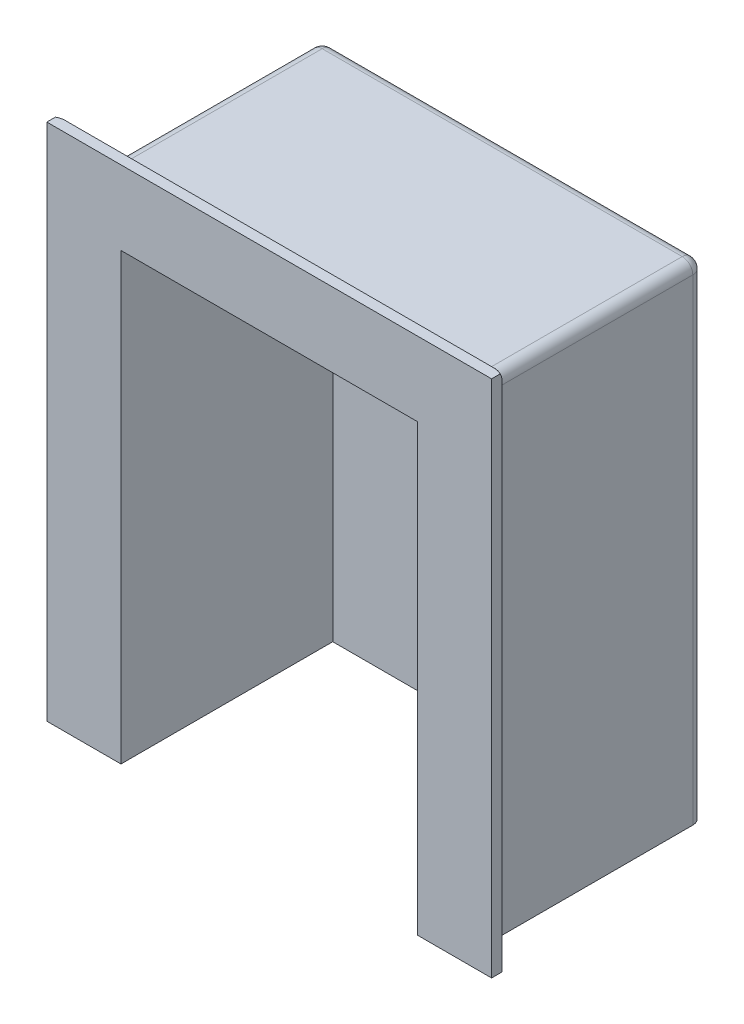
ISO-10303-21;
HEADER;
FILE_DESCRIPTION(('STEP AP214'),'2;1');
FILE_NAME('part.step','',(''),(''),'','','');
FILE_SCHEMA(('AUTOMOTIVE_DESIGN { 1 0 10303 214 1 1 1 1 }'));
ENDSEC;
DATA;
#1=APPLICATION_CONTEXT('core data for automotive mechanical design processes');
#2=APPLICATION_PROTOCOL_DEFINITION('international standard','automotive_design',2000,#1);
#3=PRODUCT_CONTEXT('',#1,'mechanical');
#4=PRODUCT('Part','Part','',(#3));
#5=PRODUCT_RELATED_PRODUCT_CATEGORY('part','',(#4));
#6=PRODUCT_DEFINITION_FORMATION('','',#4);
#7=PRODUCT_DEFINITION_CONTEXT('part definition',#1,'design');
#8=PRODUCT_DEFINITION('design','',#6,#7);
#9=PRODUCT_DEFINITION_SHAPE('','',#8);
#10=(LENGTH_UNIT() NAMED_UNIT(*) SI_UNIT(.MILLI.,.METRE.));
#11=(NAMED_UNIT(*) PLANE_ANGLE_UNIT() SI_UNIT($,.RADIAN.));
#12=(NAMED_UNIT(*) SI_UNIT($,.STERADIAN.) SOLID_ANGLE_UNIT());
#13=UNCERTAINTY_MEASURE_WITH_UNIT(LENGTH_MEASURE(1.E-05),#10,'distance_accuracy_value','');
#14=(GEOMETRIC_REPRESENTATION_CONTEXT(3) GLOBAL_UNCERTAINTY_ASSIGNED_CONTEXT((#13)) GLOBAL_UNIT_ASSIGNED_CONTEXT((#10,
#11,#12)) REPRESENTATION_CONTEXT('',''));
#15=CARTESIAN_POINT('',(0.,0.,0.));
#16=DIRECTION('',(0.,0.,1.));
#17=DIRECTION('',(1.,0.,0.));
#18=AXIS2_PLACEMENT_3D('',#15,#16,#17);
#19=CARTESIAN_POINT('',(9.,0.,11.5));
#20=DIRECTION('',(-1.,0.,0.));
#21=DIRECTION('',(0.,0.,1.));
#22=AXIS2_PLACEMENT_3D('',#19,#20,#21);
#23=PLANE('',#22);
#24=DIRECTION('',(0.,1.,0.));
#25=VECTOR('',#24,1.);
#26=CARTESIAN_POINT('',(9.,0.,0.5));
#27=LINE('',#26,#25);
#28=CARTESIAN_POINT('',(9.,-10.5,0.5));
#29=VERTEX_POINT('',#28);
#30=CARTESIAN_POINT('',(9.,12.,0.5));
#31=VERTEX_POINT('',#30);
#32=EDGE_CURVE('E336',#29,#31,#27,.T.);
#33=ORIENTED_EDGE('',*,*,#32,.T.);
#34=DIRECTION('',(0.,0.,-1.));
#35=VECTOR('',#34,1.);
#36=CARTESIAN_POINT('',(9.,12.,9.49999999999999));
#37=LINE('',#36,#35);
#38=CARTESIAN_POINT('',(9.,12.,9.49999999999999));
#39=VERTEX_POINT('',#38);
#40=EDGE_CURVE('E339',#31,#39,#37,.F.);
#41=ORIENTED_EDGE('',*,*,#40,.T.);
#42=DIRECTION('',(0.,-1.,0.));
#43=VECTOR('',#42,1.);
#44=CARTESIAN_POINT('',(9.,-10.5,9.49999999999999));
#45=LINE('',#44,#43);
#46=CARTESIAN_POINT('',(9.,-10.5,9.49999999999999));
#47=VERTEX_POINT('',#46);
#48=EDGE_CURVE('E301',#39,#47,#45,.T.);
#49=ORIENTED_EDGE('',*,*,#48,.T.);
#50=DIRECTION('',(0.,0.,-1.));
#51=VECTOR('',#50,1.);
#52=CARTESIAN_POINT('',(9.,-10.5,11.5));
#53=LINE('',#52,#51);
#54=EDGE_CURVE('E192',#47,#29,#53,.T.);
#55=ORIENTED_EDGE('',*,*,#54,.T.);
#56=EDGE_LOOP('',(#33,#41,#49,#55));
#57=FACE_BOUND('',#56,.T.);
#58=ADVANCED_FACE('F43',(#57),#23,.F.);
#59=CARTESIAN_POINT('',(0.,12.5,11.5));
#60=DIRECTION('',(0.,1.,0.));
#61=DIRECTION('',(-1.,0.,0.));
#62=AXIS2_PLACEMENT_3D('',#59,#60,#61);
#63=PLANE('',#62);
#64=DIRECTION('',(1.,0.,0.));
#65=VECTOR('',#64,1.);
#66=CARTESIAN_POINT('',(0.,12.5,9.49999999999999));
#67=LINE('',#66,#65);
#68=CARTESIAN_POINT('',(-8.5,12.5,9.49999999999999));
#69=VERTEX_POINT('',#68);
#70=CARTESIAN_POINT('',(8.5,12.5,9.49999999999999));
#71=VERTEX_POINT('',#70);
#72=EDGE_CURVE('E297',#69,#71,#67,.T.);
#73=ORIENTED_EDGE('',*,*,#72,.T.);
#74=DIRECTION('',(0.,0.,-1.));
#75=VECTOR('',#74,1.);
#76=CARTESIAN_POINT('',(8.5,12.5,0.));
#77=LINE('',#76,#75);
#78=CARTESIAN_POINT('',(8.5,12.5,0.5));
#79=VERTEX_POINT('',#78);
#80=EDGE_CURVE('E333',#71,#79,#77,.T.);
#81=ORIENTED_EDGE('',*,*,#80,.T.);
#82=DIRECTION('',(1.,0.,0.));
#83=VECTOR('',#82,1.);
#84=CARTESIAN_POINT('',(-9.,12.5,0.5));
#85=LINE('',#84,#83);
#86=CARTESIAN_POINT('',(-8.5,12.5,0.5));
#87=VERTEX_POINT('',#86);
#88=EDGE_CURVE('E327',#79,#87,#85,.F.);
#89=ORIENTED_EDGE('',*,*,#88,.T.);
#90=DIRECTION('',(0.,0.,-1.));
#91=VECTOR('',#90,1.);
#92=CARTESIAN_POINT('',(-8.5,12.5,11.5));
#93=LINE('',#92,#91);
#94=EDGE_CURVE('E330',#87,#69,#93,.F.);
#95=ORIENTED_EDGE('',*,*,#94,.T.);
#96=EDGE_LOOP('',(#73,#81,#89,#95));
#97=FACE_BOUND('',#96,.T.);
#98=ADVANCED_FACE('F461',(#97),#63,.T.);
#99=CARTESIAN_POINT('',(-9.,0.,11.5));
#100=DIRECTION('',(-1.,0.,0.));
#101=DIRECTION('',(0.,0.,1.));
#102=AXIS2_PLACEMENT_3D('',#99,#100,#101);
#103=PLANE('',#102);
#104=DIRECTION('',(0.,1.,0.));
#105=VECTOR('',#104,1.);
#106=CARTESIAN_POINT('',(-9.,0.,9.49999999999999));
#107=LINE('',#106,#105);
#108=CARTESIAN_POINT('',(-9.,-10.5,9.49999999999999));
#109=VERTEX_POINT('',#108);
#110=CARTESIAN_POINT('',(-9.,12.,9.49999999999999));
#111=VERTEX_POINT('',#110);
#112=EDGE_CURVE('E290',#109,#111,#107,.T.);
#113=ORIENTED_EDGE('',*,*,#112,.T.);
#114=DIRECTION('',(0.,0.,-1.));
#115=VECTOR('',#114,1.);
#116=CARTESIAN_POINT('',(-9.,12.,11.5));
#117=LINE('',#116,#115);
#118=CARTESIAN_POINT('',(-9.,12.,0.5));
#119=VERTEX_POINT('',#118);
#120=EDGE_CURVE('E345',#111,#119,#117,.T.);
#121=ORIENTED_EDGE('',*,*,#120,.T.);
#122=DIRECTION('',(0.,1.,0.));
#123=VECTOR('',#122,1.);
#124=CARTESIAN_POINT('',(-9.,-10.5,0.5));
#125=LINE('',#124,#123);
#126=CARTESIAN_POINT('',(-9.,-10.5,0.5));
#127=VERTEX_POINT('',#126);
#128=EDGE_CURVE('E342',#119,#127,#125,.F.);
#129=ORIENTED_EDGE('',*,*,#128,.T.);
#130=DIRECTION('',(0.,0.,-1.));
#131=VECTOR('',#130,1.);
#132=CARTESIAN_POINT('',(-9.,-10.5,11.5));
#133=LINE('',#132,#131);
#134=EDGE_CURVE('E266',#109,#127,#133,.T.);
#135=ORIENTED_EDGE('',*,*,#134,.F.);
#136=EDGE_LOOP('',(#113,#121,#129,#135));
#137=FACE_BOUND('',#136,.T.);
#138=ADVANCED_FACE('F466',(#137),#103,.T.);
#139=CARTESIAN_POINT('',(0.,-10.5,1.5));
#140=DIRECTION('',(0.,1.,0.));
#141=DIRECTION('',(0.,0.,1.));
#142=AXIS2_PLACEMENT_3D('',#139,#140,#141);
#143=PLANE('',#142);
#144=ORIENTED_EDGE('',*,*,#134,.T.);
#145=CARTESIAN_POINT('',(-8.5,-10.5,0.5));
#146=DIRECTION('',(0.,1.,0.));
#147=DIRECTION('',(0.,0.,1.));
#148=AXIS2_PLACEMENT_3D('',#145,#146,#147);
#149=CIRCLE('',#148,0.5);
#150=CARTESIAN_POINT('',(-8.5,-10.5,0.));
#151=VERTEX_POINT('',#150);
#152=EDGE_CURVE('E360',#127,#151,#149,.F.);
#153=ORIENTED_EDGE('',*,*,#152,.T.);
#154=DIRECTION('',(1.,0.,0.));
#155=VECTOR('',#154,1.);
#156=CARTESIAN_POINT('',(0.,-10.5,0.));
#157=LINE('',#156,#155);
#158=CARTESIAN_POINT('',(8.5,-10.5,0.));
#159=VERTEX_POINT('',#158);
#160=EDGE_CURVE('E275',#151,#159,#157,.T.);
#161=ORIENTED_EDGE('',*,*,#160,.T.);
#162=CARTESIAN_POINT('',(8.5,-10.5,0.5));
#163=DIRECTION('',(0.,1.,0.));
#164=DIRECTION('',(0.,0.,1.));
#165=AXIS2_PLACEMENT_3D('',#162,#163,#164);
#166=CIRCLE('',#165,0.5);
#167=EDGE_CURVE('E357',#159,#29,#166,.F.);
#168=ORIENTED_EDGE('',*,*,#167,.T.);
#169=ORIENTED_EDGE('',*,*,#54,.F.);
#170=DIRECTION('',(-0.707106781186545,0.,-0.70710678118655));
#171=VECTOR('',#170,1.);
#172=CARTESIAN_POINT('',(0.500000000000034,-10.5,0.999999999999969));
#173=LINE('',#172,#171);
#174=CARTESIAN_POINT('',(10.5,-10.5,11.));
#175=VERTEX_POINT('',#174);
#176=EDGE_CURVE('E184',#47,#175,#173,.F.);
#177=ORIENTED_EDGE('',*,*,#176,.T.);
#178=DIRECTION('',(0.,0.,1.));
#179=VECTOR('',#178,1.);
#180=CARTESIAN_POINT('',(10.5,-10.5,11.));
#181=LINE('',#180,#179);
#182=CARTESIAN_POINT('',(10.5,-10.5,11.5));
#183=VERTEX_POINT('',#182);
#184=EDGE_CURVE('E189',#175,#183,#181,.T.);
#185=ORIENTED_EDGE('',*,*,#184,.T.);
#186=DIRECTION('',(1.,0.,0.));
#187=VECTOR('',#186,1.);
#188=CARTESIAN_POINT('',(0.,-10.5,11.5));
#189=LINE('',#188,#187);
#190=CARTESIAN_POINT('',(7.,-10.5,11.5));
#191=VERTEX_POINT('',#190);
#192=EDGE_CURVE('E243',#191,#183,#189,.T.);
#193=ORIENTED_EDGE('',*,*,#192,.F.);
#194=DIRECTION('',(0.,0.,-1.));
#195=VECTOR('',#194,1.);
#196=CARTESIAN_POINT('',(7.,-10.5,11.5));
#197=LINE('',#196,#195);
#198=CARTESIAN_POINT('',(7.,-10.5,1.5));
#199=VERTEX_POINT('',#198);
#200=EDGE_CURVE('E271',#191,#199,#197,.T.);
#201=ORIENTED_EDGE('',*,*,#200,.T.);
#202=DIRECTION('',(1.,0.,0.));
#203=VECTOR('',#202,1.);
#204=CARTESIAN_POINT('',(0.,-10.5,1.5));
#205=LINE('',#204,#203);
#206=CARTESIAN_POINT('',(-7.,-10.5,1.5));
#207=VERTEX_POINT('',#206);
#208=EDGE_CURVE('E276',#207,#199,#205,.T.);
#209=ORIENTED_EDGE('',*,*,#208,.F.);
#210=DIRECTION('',(0.,0.,-1.));
#211=VECTOR('',#210,1.);
#212=CARTESIAN_POINT('',(-7.,-10.5,11.5));
#213=LINE('',#212,#211);
#214=CARTESIAN_POINT('',(-7.,-10.5,11.5));
#215=VERTEX_POINT('',#214);
#216=EDGE_CURVE('E263',#215,#207,#213,.T.);
#217=ORIENTED_EDGE('',*,*,#216,.F.);
#218=DIRECTION('',(-1.,0.,0.));
#219=VECTOR('',#218,1.);
#220=CARTESIAN_POINT('',(0.,-10.5,11.5));
#221=LINE('',#220,#219);
#222=CARTESIAN_POINT('',(-10.5,-10.5,11.5));
#223=VERTEX_POINT('',#222);
#224=EDGE_CURVE('E246',#215,#223,#221,.T.);
#225=ORIENTED_EDGE('',*,*,#224,.T.);
#226=DIRECTION('',(0.,0.,1.));
#227=VECTOR('',#226,1.);
#228=CARTESIAN_POINT('',(-10.5,-10.5,11.));
#229=LINE('',#228,#227);
#230=CARTESIAN_POINT('',(-10.5,-10.5,11.));
#231=VERTEX_POINT('',#230);
#232=EDGE_CURVE('E230',#231,#223,#229,.T.);
#233=ORIENTED_EDGE('',*,*,#232,.F.);
#234=DIRECTION('',(0.707106781186545,0.,-0.70710678118655));
#235=VECTOR('',#234,1.);
#236=CARTESIAN_POINT('',(-0.500000000000034,-10.5,0.999999999999969));
#237=LINE('',#236,#235);
#238=EDGE_CURVE('E198',#231,#109,#237,.T.);
#239=ORIENTED_EDGE('',*,*,#238,.T.);
#240=EDGE_LOOP('',(#144,#153,#161,#168,#169,#177,#185,#193,#201,#209,#217,#225,#233,#239));
#241=FACE_BOUND('',#240,.T.);
#242=ADVANCED_FACE('F187',(#241),#143,.F.);
#243=CARTESIAN_POINT('',(0.,0.,1.5));
#244=DIRECTION('',(0.,0.,1.));
#245=DIRECTION('',(1.,0.,0.));
#246=AXIS2_PLACEMENT_3D('',#243,#244,#245);
#247=PLANE('',#246);
#248=ORIENTED_EDGE('',*,*,#208,.T.);
#249=DIRECTION('',(0.,1.,0.));
#250=VECTOR('',#249,1.);
#251=CARTESIAN_POINT('',(7.,0.,1.5));
#252=LINE('',#251,#250);
#253=CARTESIAN_POINT('',(7.,10.5,1.5));
#254=VERTEX_POINT('',#253);
#255=EDGE_CURVE('E280',#199,#254,#252,.T.);
#256=ORIENTED_EDGE('',*,*,#255,.T.);
#257=DIRECTION('',(1.,0.,0.));
#258=VECTOR('',#257,1.);
#259=CARTESIAN_POINT('',(0.,10.5,1.5));
#260=LINE('',#259,#258);
#261=CARTESIAN_POINT('',(-7.,10.5,1.5));
#262=VERTEX_POINT('',#261);
#263=EDGE_CURVE('E284',#262,#254,#260,.T.);
#264=ORIENTED_EDGE('',*,*,#263,.F.);
#265=DIRECTION('',(0.,1.,0.));
#266=VECTOR('',#265,1.);
#267=CARTESIAN_POINT('',(-7.,0.,1.5));
#268=LINE('',#267,#266);
#269=EDGE_CURVE('E287',#207,#262,#268,.T.);
#270=ORIENTED_EDGE('',*,*,#269,.F.);
#271=EDGE_LOOP('',(#248,#256,#264,#270));
#272=FACE_BOUND('',#271,.T.);
#273=ADVANCED_FACE('F437',(#272),#247,.T.);
#274=CARTESIAN_POINT('',(0.,0.,0.));
#275=DIRECTION('',(0.,0.,1.));
#276=DIRECTION('',(1.,0.,0.));
#277=AXIS2_PLACEMENT_3D('',#274,#275,#276);
#278=PLANE('',#277);
#279=ORIENTED_EDGE('',*,*,#160,.F.);
#280=DIRECTION('',(0.,1.,0.));
#281=VECTOR('',#280,1.);
#282=CARTESIAN_POINT('',(-8.5,12.5,0.));
#283=LINE('',#282,#281);
#284=CARTESIAN_POINT('',(-8.5,12.,0.));
#285=VERTEX_POINT('',#284);
#286=EDGE_CURVE('E354',#151,#285,#283,.T.);
#287=ORIENTED_EDGE('',*,*,#286,.T.);
#288=DIRECTION('',(1.,0.,0.));
#289=VECTOR('',#288,1.);
#290=CARTESIAN_POINT('',(9.,12.,0.));
#291=LINE('',#290,#289);
#292=CARTESIAN_POINT('',(8.5,12.,0.));
#293=VERTEX_POINT('',#292);
#294=EDGE_CURVE('E348',#285,#293,#291,.T.);
#295=ORIENTED_EDGE('',*,*,#294,.T.);
#296=DIRECTION('',(0.,1.,0.));
#297=VECTOR('',#296,1.);
#298=CARTESIAN_POINT('',(8.5,0.,0.));
#299=LINE('',#298,#297);
#300=EDGE_CURVE('E351',#293,#159,#299,.F.);
#301=ORIENTED_EDGE('',*,*,#300,.T.);
#302=EDGE_LOOP('',(#279,#287,#295,#301));
#303=FACE_BOUND('',#302,.T.);
#304=ADVANCED_FACE('F449',(#303),#278,.F.);
#305=CARTESIAN_POINT('',(7.,0.,11.5));
#306=DIRECTION('',(-1.,0.,0.));
#307=DIRECTION('',(0.,0.,1.));
#308=AXIS2_PLACEMENT_3D('',#305,#306,#307);
#309=PLANE('',#308);
#310=DIRECTION('',(0.,0.,-1.));
#311=VECTOR('',#310,1.);
#312=CARTESIAN_POINT('',(7.,10.5,11.5));
#313=LINE('',#312,#311);
#314=CARTESIAN_POINT('',(7.,10.5,11.5));
#315=VERTEX_POINT('',#314);
#316=EDGE_CURVE('E255',#315,#254,#313,.T.);
#317=ORIENTED_EDGE('',*,*,#316,.T.);
#318=ORIENTED_EDGE('',*,*,#255,.F.);
#319=ORIENTED_EDGE('',*,*,#200,.F.);
#320=DIRECTION('',(0.,1.,0.));
#321=VECTOR('',#320,1.);
#322=CARTESIAN_POINT('',(7.,0.,11.5));
#323=LINE('',#322,#321);
#324=EDGE_CURVE('E234',#191,#315,#323,.T.);
#325=ORIENTED_EDGE('',*,*,#324,.T.);
#326=EDGE_LOOP('',(#317,#318,#319,#325));
#327=FACE_BOUND('',#326,.T.);
#328=ADVANCED_FACE('F447',(#327),#309,.T.);
#329=CARTESIAN_POINT('',(-7.,0.,11.5));
#330=DIRECTION('',(-1.,0.,0.));
#331=DIRECTION('',(0.,0.,1.));
#332=AXIS2_PLACEMENT_3D('',#329,#330,#331);
#333=PLANE('',#332);
#334=ORIENTED_EDGE('',*,*,#269,.T.);
#335=DIRECTION('',(0.,0.,-1.));
#336=VECTOR('',#335,1.);
#337=CARTESIAN_POINT('',(-7.,10.5,11.5));
#338=LINE('',#337,#336);
#339=CARTESIAN_POINT('',(-7.,10.5,11.5));
#340=VERTEX_POINT('',#339);
#341=EDGE_CURVE('E259',#340,#262,#338,.T.);
#342=ORIENTED_EDGE('',*,*,#341,.F.);
#343=DIRECTION('',(0.,1.,0.));
#344=VECTOR('',#343,1.);
#345=CARTESIAN_POINT('',(-7.,0.,11.5));
#346=LINE('',#345,#344);
#347=EDGE_CURVE('E249',#215,#340,#346,.T.);
#348=ORIENTED_EDGE('',*,*,#347,.F.);
#349=ORIENTED_EDGE('',*,*,#216,.T.);
#350=EDGE_LOOP('',(#334,#342,#348,#349));
#351=FACE_BOUND('',#350,.T.);
#352=ADVANCED_FACE('F441',(#351),#333,.F.);
#353=CARTESIAN_POINT('',(0.,10.5,11.5));
#354=DIRECTION('',(0.,1.,0.));
#355=DIRECTION('',(0.,0.,1.));
#356=AXIS2_PLACEMENT_3D('',#353,#354,#355);
#357=PLANE('',#356);
#358=ORIENTED_EDGE('',*,*,#263,.T.);
#359=ORIENTED_EDGE('',*,*,#316,.F.);
#360=DIRECTION('',(1.,0.,0.));
#361=VECTOR('',#360,1.);
#362=CARTESIAN_POINT('',(0.,10.5,11.5));
#363=LINE('',#362,#361);
#364=EDGE_CURVE('E252',#340,#315,#363,.T.);
#365=ORIENTED_EDGE('',*,*,#364,.F.);
#366=ORIENTED_EDGE('',*,*,#341,.T.);
#367=EDGE_LOOP('',(#358,#359,#365,#366));
#368=FACE_BOUND('',#367,.T.);
#369=ADVANCED_FACE('F445',(#368),#357,.F.);
#370=CARTESIAN_POINT('',(0.,0.,11.5));
#371=DIRECTION('',(0.,0.,1.));
#372=DIRECTION('',(1.,0.,0.));
#373=AXIS2_PLACEMENT_3D('',#370,#371,#372);
#374=PLANE('',#373);
#375=ORIENTED_EDGE('',*,*,#192,.T.);
#376=DIRECTION('',(0.,1.,0.));
#377=VECTOR('',#376,1.);
#378=CARTESIAN_POINT('',(10.5,14.,11.5));
#379=LINE('',#378,#377);
#380=CARTESIAN_POINT('',(10.5,14.,11.5));
#381=VERTEX_POINT('',#380);
#382=EDGE_CURVE('E205',#183,#381,#379,.T.);
#383=ORIENTED_EDGE('',*,*,#382,.T.);
#384=DIRECTION('',(-1.,0.,0.));
#385=VECTOR('',#384,1.);
#386=CARTESIAN_POINT('',(-10.5,14.,11.5));
#387=LINE('',#386,#385);
#388=CARTESIAN_POINT('',(-10.5,14.,11.5));
#389=VERTEX_POINT('',#388);
#390=EDGE_CURVE('E220',#381,#389,#387,.T.);
#391=ORIENTED_EDGE('',*,*,#390,.T.);
#392=DIRECTION('',(0.,-1.,0.));
#393=VECTOR('',#392,1.);
#394=CARTESIAN_POINT('',(-10.5,-10.5,11.5));
#395=LINE('',#394,#393);
#396=EDGE_CURVE('E213',#389,#223,#395,.T.);
#397=ORIENTED_EDGE('',*,*,#396,.T.);
#398=ORIENTED_EDGE('',*,*,#224,.F.);
#399=ORIENTED_EDGE('',*,*,#347,.T.);
#400=ORIENTED_EDGE('',*,*,#364,.T.);
#401=ORIENTED_EDGE('',*,*,#324,.F.);
#402=EDGE_LOOP('',(#375,#383,#391,#397,#398,#399,#400,#401));
#403=FACE_BOUND('',#402,.T.);
#404=ADVANCED_FACE('F431',(#403),#374,.T.);
#405=CARTESIAN_POINT('',(-10.5,-10.5,11.));
#406=DIRECTION('',(-1.,0.,0.));
#407=DIRECTION('',(0.,0.,1.));
#408=AXIS2_PLACEMENT_3D('',#405,#406,#407);
#409=PLANE('',#408);
#410=DIRECTION('',(0.,0.,1.));
#411=VECTOR('',#410,1.);
#412=CARTESIAN_POINT('',(-10.5,14.,11.));
#413=LINE('',#412,#411);
#414=CARTESIAN_POINT('',(-10.5,14.,11.0947343454908));
#415=VERTEX_POINT('',#414);
#416=EDGE_CURVE('E235',#415,#389,#413,.T.);
#417=ORIENTED_EDGE('',*,*,#416,.F.);
#418=CARTESIAN_POINT('',(-10.5,14.,11.7071067811866));
#419=DIRECTION('',(-1.,0.,0.));
#420=DIRECTION('',(0.,-0.707106781186545,-0.70710678118655));
#421=AXIS2_PLACEMENT_3D('',#418,#419,#420);
#422=ELLIPSE('',#421,0.866025403784441,0.5);
#423=CARTESIAN_POINT('',(-10.5,13.6464466094067,11.));
#424=VERTEX_POINT('',#423);
#425=EDGE_CURVE('E319',#415,#424,#422,.T.);
#426=ORIENTED_EDGE('',*,*,#425,.T.);
#427=DIRECTION('',(0.,-1.,0.));
#428=VECTOR('',#427,1.);
#429=CARTESIAN_POINT('',(-10.5,-10.5,11.));
#430=LINE('',#429,#428);
#431=EDGE_CURVE('E208',#424,#231,#430,.T.);
#432=ORIENTED_EDGE('',*,*,#431,.T.);
#433=ORIENTED_EDGE('',*,*,#232,.T.);
#434=ORIENTED_EDGE('',*,*,#396,.F.);
#435=EDGE_LOOP('',(#417,#426,#432,#433,#434));
#436=FACE_BOUND('',#435,.T.);
#437=ADVANCED_FACE('F426',(#436),#409,.T.);
#438=CARTESIAN_POINT('',(-10.5,14.,11.));
#439=DIRECTION('',(0.,1.,0.));
#440=DIRECTION('',(0.,0.,1.));
#441=AXIS2_PLACEMENT_3D('',#438,#439,#440);
#442=PLANE('',#441);
#443=DIRECTION('',(-1.,0.,0.));
#444=VECTOR('',#443,1.);
#445=CARTESIAN_POINT('',(-10.5,14.,11.));
#446=LINE('',#445,#444);
#447=CARTESIAN_POINT('',(10.1464466094067,14.,11.));
#448=VERTEX_POINT('',#447);
#449=CARTESIAN_POINT('',(-10.1464466094067,14.,11.));
#450=VERTEX_POINT('',#449);
#451=EDGE_CURVE('E212',#448,#450,#446,.T.);
#452=ORIENTED_EDGE('',*,*,#451,.T.);
#453=CARTESIAN_POINT('',(-10.5,14.,11.7071067811866));
#454=DIRECTION('',(0.,1.,0.));
#455=DIRECTION('',(0.707106781186545,0.,-0.70710678118655));
#456=AXIS2_PLACEMENT_3D('',#453,#454,#455);
#457=ELLIPSE('',#456,0.866025403784441,0.5);
#458=EDGE_CURVE('E316',#450,#415,#457,.T.);
#459=ORIENTED_EDGE('',*,*,#458,.T.);
#460=ORIENTED_EDGE('',*,*,#416,.T.);
#461=ORIENTED_EDGE('',*,*,#390,.F.);
#462=DIRECTION('',(0.,0.,1.));
#463=VECTOR('',#462,1.);
#464=CARTESIAN_POINT('',(10.5,14.,11.));
#465=LINE('',#464,#463);
#466=CARTESIAN_POINT('',(10.5,14.,11.0947343454908));
#467=VERTEX_POINT('',#466);
#468=EDGE_CURVE('E207',#467,#381,#465,.T.);
#469=ORIENTED_EDGE('',*,*,#468,.F.);
#470=CARTESIAN_POINT('',(10.5,14.,11.7071067811866));
#471=DIRECTION('',(0.,1.,0.));
#472=DIRECTION('',(0.707106781186545,0.,0.70710678118655));
#473=AXIS2_PLACEMENT_3D('',#470,#471,#472);
#474=ELLIPSE('',#473,0.866025403784441,0.5);
#475=EDGE_CURVE('E313',#467,#448,#474,.T.);
#476=ORIENTED_EDGE('',*,*,#475,.T.);
#477=EDGE_LOOP('',(#452,#459,#460,#461,#469,#476));
#478=FACE_BOUND('',#477,.T.);
#479=ADVANCED_FACE('F412',(#478),#442,.T.);
#480=CARTESIAN_POINT('',(10.5,14.,11.));
#481=DIRECTION('',(1.,0.,0.));
#482=DIRECTION('',(0.,0.,-1.));
#483=AXIS2_PLACEMENT_3D('',#480,#481,#482);
#484=PLANE('',#483);
#485=DIRECTION('',(0.,1.,0.));
#486=VECTOR('',#485,1.);
#487=CARTESIAN_POINT('',(10.5,14.,11.));
#488=LINE('',#487,#486);
#489=CARTESIAN_POINT('',(10.5,13.6464466094067,11.));
#490=VERTEX_POINT('',#489);
#491=EDGE_CURVE('E203',#175,#490,#488,.T.);
#492=ORIENTED_EDGE('',*,*,#491,.T.);
#493=CARTESIAN_POINT('',(10.5,14.,11.7071067811866));
#494=DIRECTION('',(1.,0.,0.));
#495=DIRECTION('',(0.,0.707106781186545,0.70710678118655));
#496=AXIS2_PLACEMENT_3D('',#493,#494,#495);
#497=ELLIPSE('',#496,0.866025403784441,0.5);
#498=EDGE_CURVE('E324',#490,#467,#497,.T.);
#499=ORIENTED_EDGE('',*,*,#498,.T.);
#500=ORIENTED_EDGE('',*,*,#468,.T.);
#501=ORIENTED_EDGE('',*,*,#382,.F.);
#502=ORIENTED_EDGE('',*,*,#184,.F.);
#503=EDGE_LOOP('',(#492,#499,#500,#501,#502));
#504=FACE_BOUND('',#503,.T.);
#505=ADVANCED_FACE('F202',(#504),#484,.T.);
#506=CARTESIAN_POINT('',(9.,0.,9.49999999999999));
#507=DIRECTION('',(0.70710678118655,0.,-0.707106781186545));
#508=DIRECTION('',(0.,1.,0.));
#509=AXIS2_PLACEMENT_3D('',#506,#507,#508);
#510=PLANE('',#509);
#511=ORIENTED_EDGE('',*,*,#48,.F.);
#512=CARTESIAN_POINT('',(8.5,12.,8.99999999999999));
#513=DIRECTION('',(0.70710678118655,0.,-0.707106781186545));
#514=DIRECTION('',(0.707106781186545,0.,0.70710678118655));
#515=AXIS2_PLACEMENT_3D('',#512,#513,#514);
#516=ELLIPSE('',#515,0.70710678118655,0.5);
#517=CARTESIAN_POINT('',(8.98296291314453,12.1294095225513,9.48296291314453));
#518=VERTEX_POINT('',#517);
#519=EDGE_CURVE('E363',#39,#518,#516,.F.);
#520=ORIENTED_EDGE('',*,*,#519,.T.);
#521=DIRECTION('',(-0.577350269189625,-0.577350269189625,-0.577350269189629));
#522=VECTOR('',#521,1.);
#523=CARTESIAN_POINT('',(4.95118446353111,8.09763107293783,5.45118446353108));
#524=LINE('',#523,#522);
#525=EDGE_CURVE('E61',#518,#490,#524,.F.);
#526=ORIENTED_EDGE('',*,*,#525,.T.);
#527=ORIENTED_EDGE('',*,*,#491,.F.);
#528=ORIENTED_EDGE('',*,*,#176,.F.);
#529=EDGE_LOOP('',(#511,#520,#526,#527,#528));
#530=FACE_BOUND('',#529,.T.);
#531=ADVANCED_FACE('F210',(#530),#510,.T.);
#532=CARTESIAN_POINT('',(0.,12.5,9.49999999999999));
#533=DIRECTION('',(0.,-0.70710678118655,0.707106781186545));
#534=DIRECTION('',(1.,0.,0.));
#535=AXIS2_PLACEMENT_3D('',#532,#533,#534);
#536=PLANE('',#535);
#537=ORIENTED_EDGE('',*,*,#72,.F.);
#538=CARTESIAN_POINT('',(-8.5,12.,8.99999999999999));
#539=DIRECTION('',(0.,-0.70710678118655,0.707106781186545));
#540=DIRECTION('',(0.,-0.707106781186545,-0.70710678118655));
#541=AXIS2_PLACEMENT_3D('',#538,#539,#540);
#542=ELLIPSE('',#541,0.70710678118655,0.5);
#543=CARTESIAN_POINT('',(-8.62940952255126,12.4829629131445,9.48296291314453));
#544=VERTEX_POINT('',#543);
#545=EDGE_CURVE('E53',#69,#544,#542,.T.);
#546=ORIENTED_EDGE('',*,*,#545,.T.);
#547=DIRECTION('',(0.577350269189625,-0.577350269189625,-0.577350269189629));
#548=VECTOR('',#547,1.);
#549=CARTESIAN_POINT('',(-5.7642977396045,9.61785113019777,6.61785113019774));
#550=LINE('',#549,#548);
#551=EDGE_CURVE('E310',#544,#450,#550,.F.);
#552=ORIENTED_EDGE('',*,*,#551,.T.);
#553=ORIENTED_EDGE('',*,*,#451,.F.);
#554=DIRECTION('',(0.577350269189625,0.577350269189625,0.577350269189629));
#555=VECTOR('',#554,1.);
#556=CARTESIAN_POINT('',(5.7642977396045,9.61785113019777,6.61785113019775));
#557=LINE('',#556,#555);
#558=CARTESIAN_POINT('',(8.62940952255126,12.4829629131445,9.48296291314453));
#559=VERTEX_POINT('',#558);
#560=EDGE_CURVE('E69',#448,#559,#557,.F.);
#561=ORIENTED_EDGE('',*,*,#560,.T.);
#562=CARTESIAN_POINT('',(8.5,12.,8.99999999999999));
#563=DIRECTION('',(0.,-0.70710678118655,0.707106781186545));
#564=DIRECTION('',(0.,0.707106781186545,0.70710678118655));
#565=AXIS2_PLACEMENT_3D('',#562,#563,#564);
#566=ELLIPSE('',#565,0.70710678118655,0.5);
#567=EDGE_CURVE('E366',#559,#71,#566,.T.);
#568=ORIENTED_EDGE('',*,*,#567,.T.);
#569=EDGE_LOOP('',(#537,#546,#552,#553,#561,#568));
#570=FACE_BOUND('',#569,.T.);
#571=ADVANCED_FACE('F416',(#570),#536,.F.);
#572=CARTESIAN_POINT('',(-9.,0.,9.49999999999999));
#573=DIRECTION('',(0.70710678118655,0.,0.707106781186545));
#574=DIRECTION('',(0.,1.,0.));
#575=AXIS2_PLACEMENT_3D('',#572,#573,#574);
#576=PLANE('',#575);
#577=ORIENTED_EDGE('',*,*,#431,.F.);
#578=DIRECTION('',(0.577350269189625,-0.577350269189625,-0.577350269189629));
#579=VECTOR('',#578,1.);
#580=CARTESIAN_POINT('',(-4.95118446353111,8.09763107293784,5.45118446353108));
#581=LINE('',#580,#579);
#582=CARTESIAN_POINT('',(-8.98296291314453,12.1294095225513,9.48296291314453));
#583=VERTEX_POINT('',#582);
#584=EDGE_CURVE('E197',#424,#583,#581,.T.);
#585=ORIENTED_EDGE('',*,*,#584,.T.);
#586=CARTESIAN_POINT('',(-8.5,12.,8.99999999999999));
#587=DIRECTION('',(0.70710678118655,0.,0.707106781186545));
#588=DIRECTION('',(0.707106781186545,0.,-0.70710678118655));
#589=AXIS2_PLACEMENT_3D('',#586,#587,#588);
#590=ELLIPSE('',#589,0.70710678118655,0.5);
#591=EDGE_CURVE('E11',#583,#111,#590,.T.);
#592=ORIENTED_EDGE('',*,*,#591,.T.);
#593=ORIENTED_EDGE('',*,*,#112,.F.);
#594=ORIENTED_EDGE('',*,*,#238,.F.);
#595=EDGE_LOOP('',(#577,#585,#592,#593,#594));
#596=FACE_BOUND('',#595,.T.);
#597=ADVANCED_FACE('F507',(#596),#576,.F.);
#598=CARTESIAN_POINT('',(5.7642977396045,9.2642977396045,6.97140452079102));
#599=DIRECTION('',(0.577350269189624,0.577350269189624,0.577350269189628));
#600=DIRECTION('',(0.70710678118655,0.,-0.707106781186545));
#601=AXIS2_PLACEMENT_3D('',#598,#599,#600);
#602=CYLINDRICAL_SURFACE('',#601,0.5);
#603=ORIENTED_EDGE('',*,*,#525,.F.);
#604=CARTESIAN_POINT('',(8.5,12.,9.70710678118654));
#605=DIRECTION('',(0.325057583671867,0.325057583671867,0.888073833977116));
#606=DIRECTION('',(0.627963030199555,0.627963030199555,-0.459700843380982));
#607=AXIS2_PLACEMENT_3D('',#604,#605,#606);
#608=ELLIPSE('',#607,0.563016250305247,0.5);
#609=EDGE_CURVE('E47',#559,#518,#608,.F.);
#610=ORIENTED_EDGE('',*,*,#609,.F.);
#611=ORIENTED_EDGE('',*,*,#560,.F.);
#612=ORIENTED_EDGE('',*,*,#475,.F.);
#613=ORIENTED_EDGE('',*,*,#498,.F.);
#614=EDGE_LOOP('',(#603,#610,#611,#612,#613));
#615=FACE_BOUND('',#614,.T.);
#616=ADVANCED_FACE('F45',(#615),#602,.T.);
#617=CARTESIAN_POINT('',(8.5,0.,0.5));
#618=DIRECTION('',(0.,1.,0.));
#619=DIRECTION('',(0.,0.,1.));
#620=AXIS2_PLACEMENT_3D('',#617,#618,#619);
#621=CYLINDRICAL_SURFACE('',#620,0.5);
#622=ORIENTED_EDGE('',*,*,#167,.F.);
#623=ORIENTED_EDGE('',*,*,#300,.F.);
#624=CARTESIAN_POINT('',(8.5,12.,0.5));
#625=DIRECTION('',(0.,1.,0.));
#626=DIRECTION('',(0.,0.,1.));
#627=AXIS2_PLACEMENT_3D('',#624,#625,#626);
#628=CIRCLE('',#627,0.5);
#629=EDGE_CURVE('E395',#31,#293,#628,.T.);
#630=ORIENTED_EDGE('',*,*,#629,.F.);
#631=ORIENTED_EDGE('',*,*,#32,.F.);
#632=EDGE_LOOP('',(#622,#623,#630,#631));
#633=FACE_BOUND('',#632,.T.);
#634=ADVANCED_FACE('F521',(#633),#621,.T.);
#635=CARTESIAN_POINT('',(8.5,12.,11.5));
#636=DIRECTION('',(0.,0.,1.));
#637=DIRECTION('',(1.,0.,0.));
#638=AXIS2_PLACEMENT_3D('',#635,#636,#637);
#639=CYLINDRICAL_SURFACE('',#638,0.5);
#640=ORIENTED_EDGE('',*,*,#519,.F.);
#641=ORIENTED_EDGE('',*,*,#40,.F.);
#642=CARTESIAN_POINT('',(8.5,12.,0.5));
#643=DIRECTION('',(0.,0.,-1.));
#644=DIRECTION('',(-1.,0.,0.));
#645=AXIS2_PLACEMENT_3D('',#642,#643,#644);
#646=CIRCLE('',#645,0.5);
#647=EDGE_CURVE('E392',#79,#31,#646,.T.);
#648=ORIENTED_EDGE('',*,*,#647,.F.);
#649=ORIENTED_EDGE('',*,*,#80,.F.);
#650=ORIENTED_EDGE('',*,*,#567,.F.);
#651=ORIENTED_EDGE('',*,*,#609,.T.);
#652=EDGE_LOOP('',(#640,#641,#648,#649,#650,#651));
#653=FACE_BOUND('',#652,.T.);
#654=ADVANCED_FACE('F406',(#653),#639,.T.);
#655=CARTESIAN_POINT('',(8.5,12.,0.5));
#656=DIRECTION('',(1.,0.,0.));
#657=DIRECTION('',(0.,0.,-1.));
#658=AXIS2_PLACEMENT_3D('',#655,#656,#657);
#659=SPHERICAL_SURFACE('',#658,0.5);
#660=ORIENTED_EDGE('',*,*,#647,.T.);
#661=ORIENTED_EDGE('',*,*,#629,.T.);
#662=CARTESIAN_POINT('',(8.5,12.,0.5));
#663=DIRECTION('',(1.,0.,0.));
#664=DIRECTION('',(0.,0.,-1.));
#665=AXIS2_PLACEMENT_3D('',#662,#663,#664);
#666=CIRCLE('',#665,0.5);
#667=EDGE_CURVE('E388',#79,#293,#666,.F.);
#668=ORIENTED_EDGE('',*,*,#667,.F.);
#669=EDGE_LOOP('',(#660,#661,#668));
#670=FACE_BOUND('',#669,.T.);
#671=ADVANCED_FACE('F533',(#670),#659,.T.);
#672=CARTESIAN_POINT('',(-8.5,0.,0.5));
#673=DIRECTION('',(0.,-1.,0.));
#674=DIRECTION('',(0.,0.,-1.));
#675=AXIS2_PLACEMENT_3D('',#672,#673,#674);
#676=CYLINDRICAL_SURFACE('',#675,0.5);
#677=ORIENTED_EDGE('',*,*,#152,.F.);
#678=ORIENTED_EDGE('',*,*,#128,.F.);
#679=CARTESIAN_POINT('',(-8.5,12.,0.5));
#680=DIRECTION('',(0.,1.,0.));
#681=DIRECTION('',(-1.,0.,0.));
#682=AXIS2_PLACEMENT_3D('',#679,#680,#681);
#683=CIRCLE('',#682,0.5);
#684=EDGE_CURVE('E384',#285,#119,#683,.T.);
#685=ORIENTED_EDGE('',*,*,#684,.F.);
#686=ORIENTED_EDGE('',*,*,#286,.F.);
#687=EDGE_LOOP('',(#677,#678,#685,#686));
#688=FACE_BOUND('',#687,.T.);
#689=ADVANCED_FACE('F540',(#688),#676,.T.);
#690=CARTESIAN_POINT('',(0.,12.,0.5));
#691=DIRECTION('',(-1.,0.,0.));
#692=DIRECTION('',(0.,-1.,0.));
#693=AXIS2_PLACEMENT_3D('',#690,#691,#692);
#694=CYLINDRICAL_SURFACE('',#693,0.5);
#695=ORIENTED_EDGE('',*,*,#667,.T.);
#696=ORIENTED_EDGE('',*,*,#294,.F.);
#697=CARTESIAN_POINT('',(-8.5,12.,0.5));
#698=DIRECTION('',(-1.,0.,0.));
#699=DIRECTION('',(0.,0.,1.));
#700=AXIS2_PLACEMENT_3D('',#697,#698,#699);
#701=CIRCLE('',#700,0.5);
#702=EDGE_CURVE('E380',#87,#285,#701,.T.);
#703=ORIENTED_EDGE('',*,*,#702,.F.);
#704=ORIENTED_EDGE('',*,*,#88,.F.);
#705=EDGE_LOOP('',(#695,#696,#703,#704));
#706=FACE_BOUND('',#705,.T.);
#707=ADVANCED_FACE('F547',(#706),#694,.T.);
#708=CARTESIAN_POINT('',(-8.5,12.,0.5));
#709=DIRECTION('',(0.,0.,-1.));
#710=DIRECTION('',(0.,1.,0.));
#711=AXIS2_PLACEMENT_3D('',#708,#709,#710);
#712=SPHERICAL_SURFACE('',#711,0.5);
#713=ORIENTED_EDGE('',*,*,#702,.T.);
#714=ORIENTED_EDGE('',*,*,#684,.T.);
#715=CARTESIAN_POINT('',(-8.5,12.,0.5));
#716=DIRECTION('',(0.,0.,-1.));
#717=DIRECTION('',(-1.,0.,0.));
#718=AXIS2_PLACEMENT_3D('',#715,#716,#717);
#719=CIRCLE('',#718,0.5);
#720=EDGE_CURVE('E376',#87,#119,#719,.F.);
#721=ORIENTED_EDGE('',*,*,#720,.F.);
#722=EDGE_LOOP('',(#713,#714,#721));
#723=FACE_BOUND('',#722,.T.);
#724=ADVANCED_FACE('F555',(#723),#712,.T.);
#725=CARTESIAN_POINT('',(-8.5,12.,11.5));
#726=DIRECTION('',(0.,0.,-1.));
#727=DIRECTION('',(-1.,0.,0.));
#728=AXIS2_PLACEMENT_3D('',#725,#726,#727);
#729=CYLINDRICAL_SURFACE('',#728,0.5);
#730=ORIENTED_EDGE('',*,*,#120,.F.);
#731=ORIENTED_EDGE('',*,*,#591,.F.);
#732=CARTESIAN_POINT('',(-8.5,12.,9.70710678118654));
#733=DIRECTION('',(0.325057583671867,-0.325057583671867,-0.888073833977116));
#734=DIRECTION('',(0.627963030199555,-0.627963030199555,0.459700843380982));
#735=AXIS2_PLACEMENT_3D('',#732,#733,#734);
#736=ELLIPSE('',#735,0.563016250305247,0.5);
#737=EDGE_CURVE('E372',#544,#583,#736,.F.);
#738=ORIENTED_EDGE('',*,*,#737,.F.);
#739=ORIENTED_EDGE('',*,*,#545,.F.);
#740=ORIENTED_EDGE('',*,*,#94,.F.);
#741=ORIENTED_EDGE('',*,*,#720,.T.);
#742=EDGE_LOOP('',(#730,#731,#738,#739,#740,#741));
#743=FACE_BOUND('',#742,.T.);
#744=ADVANCED_FACE('F563',(#743),#729,.T.);
#745=CARTESIAN_POINT('',(-4.59763107293784,8.09763107293784,5.80473785412435));
#746=DIRECTION('',(0.577350269189624,-0.577350269189624,-0.577350269189628));
#747=DIRECTION('',(-0.70710678118655,0.,-0.707106781186545));
#748=AXIS2_PLACEMENT_3D('',#745,#746,#747);
#749=CYLINDRICAL_SURFACE('',#748,0.5);
#750=ORIENTED_EDGE('',*,*,#458,.F.);
#751=ORIENTED_EDGE('',*,*,#551,.F.);
#752=ORIENTED_EDGE('',*,*,#737,.T.);
#753=ORIENTED_EDGE('',*,*,#584,.F.);
#754=ORIENTED_EDGE('',*,*,#425,.F.);
#755=EDGE_LOOP('',(#750,#751,#752,#753,#754));
#756=FACE_BOUND('',#755,.T.);
#757=ADVANCED_FACE('F420',(#756),#749,.T.);
#758=CLOSED_SHELL('',(#58,#98,#138,#242,#273,#304,#328,#352,#369,#404,#437,#479,#505,#531,#571,
#597,#616,#634,#654,#671,#689,#707,#724,#744,#757));
#759=MANIFOLD_SOLID_BREP('B2',#758);
#760=ADVANCED_BREP_SHAPE_REPRESENTATION('',(#18,#759),#14);
#761=SHAPE_DEFINITION_REPRESENTATION(#9,#760);
ENDSEC;
END-ISO-10303-21;
